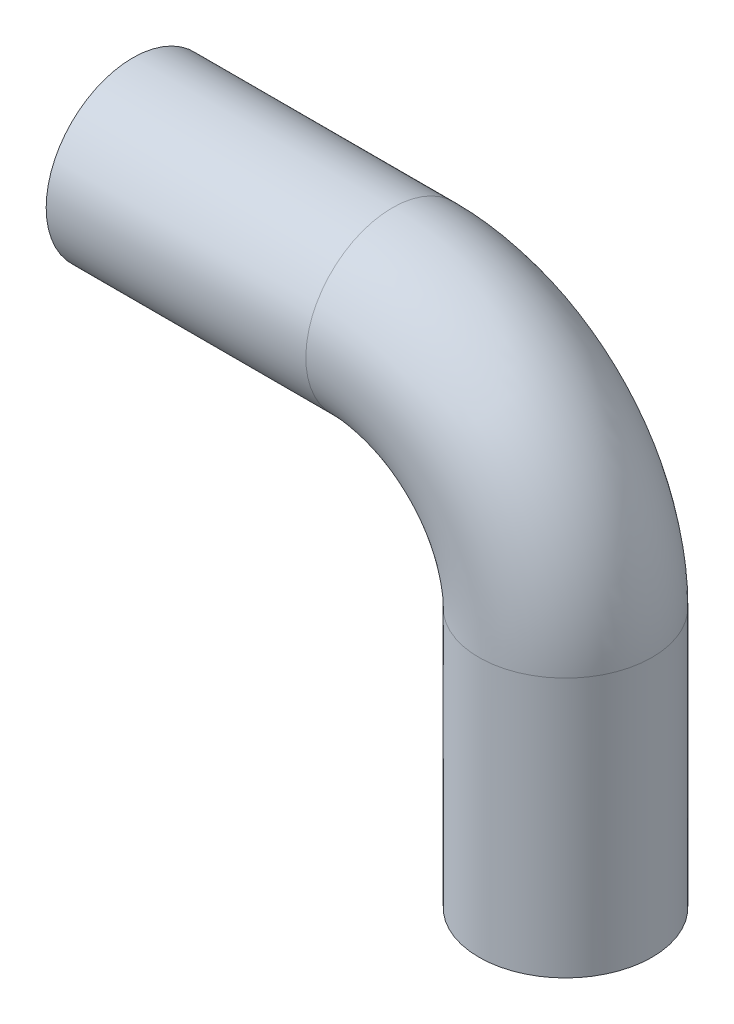
ISO-10303-21;
HEADER;
FILE_DESCRIPTION(('STEP AP214'),'2;1');
FILE_NAME('part.step','',(''),(''),'','','');
FILE_SCHEMA(('AUTOMOTIVE_DESIGN { 1 0 10303 214 1 1 1 1 }'));
ENDSEC;
DATA;
#1=APPLICATION_CONTEXT('core data for automotive mechanical design processes');
#2=APPLICATION_PROTOCOL_DEFINITION('international standard','automotive_design',2000,#1);
#3=PRODUCT_CONTEXT('',#1,'mechanical');
#4=PRODUCT('Part','Part','',(#3));
#5=PRODUCT_RELATED_PRODUCT_CATEGORY('part','',(#4));
#6=PRODUCT_DEFINITION_FORMATION('','',#4);
#7=PRODUCT_DEFINITION_CONTEXT('part definition',#1,'design');
#8=PRODUCT_DEFINITION('design','',#6,#7);
#9=PRODUCT_DEFINITION_SHAPE('','',#8);
#10=(LENGTH_UNIT() NAMED_UNIT(*) SI_UNIT(.MILLI.,.METRE.));
#11=(NAMED_UNIT(*) PLANE_ANGLE_UNIT() SI_UNIT($,.RADIAN.));
#12=(NAMED_UNIT(*) SI_UNIT($,.STERADIAN.) SOLID_ANGLE_UNIT());
#13=UNCERTAINTY_MEASURE_WITH_UNIT(LENGTH_MEASURE(1.E-05),#10,'distance_accuracy_value','');
#14=(GEOMETRIC_REPRESENTATION_CONTEXT(3) GLOBAL_UNCERTAINTY_ASSIGNED_CONTEXT((#13)) GLOBAL_UNIT_ASSIGNED_CONTEXT((#10,
#11,#12)) REPRESENTATION_CONTEXT('',''));
#15=CARTESIAN_POINT('',(0.,0.,0.));
#16=DIRECTION('',(0.,0.,1.));
#17=DIRECTION('',(1.,0.,0.));
#18=AXIS2_PLACEMENT_3D('',#15,#16,#17);
#19=CARTESIAN_POINT('',(0.,0.,0.));
#20=DIRECTION('',(-1.,0.,0.));
#21=DIRECTION('',(0.,0.,1.));
#22=AXIS2_PLACEMENT_3D('',#19,#20,#21);
#23=PLANE('',#22);
#24=CARTESIAN_POINT('',(0.,0.,0.));
#25=DIRECTION('',(-1.,0.,0.));
#26=DIRECTION('',(0.,-1.,0.));
#27=AXIS2_PLACEMENT_3D('',#24,#25,#26);
#28=CIRCLE('',#27,7.7);
#29=CARTESIAN_POINT('',(0.,-7.7,0.));
#30=VERTEX_POINT('',#29);
#31=EDGE_CURVE('E77',#30,#30,#28,.T.);
#32=ORIENTED_EDGE('',*,*,#31,.F.);
#33=EDGE_LOOP('',(#32));
#34=FACE_BOUND('',#33,.T.);
#35=CARTESIAN_POINT('',(0.,0.,0.));
#36=DIRECTION('',(-1.,0.,0.));
#37=DIRECTION('',(0.,0.,1.));
#38=AXIS2_PLACEMENT_3D('',#35,#36,#37);
#39=CIRCLE('',#38,10.);
#40=CARTESIAN_POINT('',(0.,0.,10.));
#41=VERTEX_POINT('',#40);
#42=EDGE_CURVE('E66',#41,#41,#39,.T.);
#43=ORIENTED_EDGE('',*,*,#42,.T.);
#44=EDGE_LOOP('',(#43));
#45=FACE_BOUND('',#44,.T.);
#46=ADVANCED_FACE('F49',(#34,#45),#23,.T.);
#47=CARTESIAN_POINT('',(50.,-50.,0.));
#48=DIRECTION('',(0.,1.,0.));
#49=DIRECTION('',(0.,0.,1.));
#50=AXIS2_PLACEMENT_3D('',#47,#48,#49);
#51=PLANE('',#50);
#52=CARTESIAN_POINT('',(50.,-50.,0.));
#53=DIRECTION('',(0.,1.,0.));
#54=DIRECTION('',(0.,0.,1.));
#55=AXIS2_PLACEMENT_3D('',#52,#53,#54);
#56=CIRCLE('',#55,7.7);
#57=CARTESIAN_POINT('',(50.,-50.,7.7));
#58=VERTEX_POINT('',#57);
#59=EDGE_CURVE('E72',#58,#58,#56,.T.);
#60=ORIENTED_EDGE('',*,*,#59,.T.);
#61=EDGE_LOOP('',(#60));
#62=FACE_BOUND('',#61,.T.);
#63=CARTESIAN_POINT('',(50.,-50.,0.));
#64=DIRECTION('',(0.,1.,0.));
#65=DIRECTION('',(0.,0.,1.));
#66=AXIS2_PLACEMENT_3D('',#63,#64,#65);
#67=CIRCLE('',#66,10.);
#68=CARTESIAN_POINT('',(50.,-50.,10.));
#69=VERTEX_POINT('',#68);
#70=EDGE_CURVE('E11',#69,#69,#67,.T.);
#71=ORIENTED_EDGE('',*,*,#70,.F.);
#72=EDGE_LOOP('',(#71));
#73=FACE_BOUND('',#72,.T.);
#74=ADVANCED_FACE('F100',(#62,#73),#51,.F.);
#75=CARTESIAN_POINT('',(0.,0.,0.));
#76=DIRECTION('',(1.,0.,0.));
#77=DIRECTION('',(0.,0.,-1.));
#78=AXIS2_PLACEMENT_3D('',#75,#76,#77);
#79=CYLINDRICAL_SURFACE('',#78,10.);
#80=CARTESIAN_POINT('',(29.9999999999999,0.,0.));
#81=DIRECTION('',(-1.,0.,0.));
#82=DIRECTION('',(0.,0.,1.));
#83=AXIS2_PLACEMENT_3D('',#80,#81,#82);
#84=CIRCLE('',#83,10.);
#85=CARTESIAN_POINT('',(29.9999999999998,10.,0.));
#86=VERTEX_POINT('',#85);
#87=EDGE_CURVE('E61',#86,#86,#84,.T.);
#88=ORIENTED_EDGE('',*,*,#87,.T.);
#89=EDGE_LOOP('',(#88));
#90=FACE_BOUND('',#89,.T.);
#91=ORIENTED_EDGE('',*,*,#42,.F.);
#92=EDGE_LOOP('',(#91));
#93=FACE_BOUND('',#92,.T.);
#94=ADVANCED_FACE('F104',(#90,#93),#79,.T.);
#95=CARTESIAN_POINT('',(30.,-20.,0.));
#96=DIRECTION('',(0.,0.,-1.));
#97=DIRECTION('',(-1.,0.,0.));
#98=AXIS2_PLACEMENT_3D('',#95,#96,#97);
#99=TOROIDAL_SURFACE('',#98,20.,10.);
#100=CARTESIAN_POINT('',(50.,-20.,0.));
#101=DIRECTION('',(0.,1.,0.));
#102=DIRECTION('',(0.,0.,1.));
#103=AXIS2_PLACEMENT_3D('',#100,#101,#102);
#104=CIRCLE('',#103,10.);
#105=CARTESIAN_POINT('',(60.,-20.,0.));
#106=VERTEX_POINT('',#105);
#107=EDGE_CURVE('E56',#106,#106,#104,.T.);
#108=CARTESIAN_POINT('',(30.,-20.,0.));
#109=DIRECTION('',(0.,0.,-1.));
#110=DIRECTION('',(-1.,0.,0.));
#111=AXIS2_PLACEMENT_3D('',#108,#109,#110);
#112=CIRCLE('',#111,30.);
#113=EDGE_CURVE('',#86,#106,#112,.T.);
#114=ORIENTED_EDGE('',*,*,#87,.F.);
#115=ORIENTED_EDGE('',*,*,#107,.T.);
#116=ORIENTED_EDGE('',*,*,#113,.T.);
#117=ORIENTED_EDGE('',*,*,#113,.F.);
#118=EDGE_LOOP('',(#114,#116,#115,#117));
#119=FACE_BOUND('',#118,.T.);
#120=ADVANCED_FACE('F106',(#119),#99,.T.);
#121=CARTESIAN_POINT('',(50.,-20.0000000000001,0.));
#122=DIRECTION('',(0.,-1.,0.));
#123=DIRECTION('',(1.,0.,0.));
#124=AXIS2_PLACEMENT_3D('',#121,#122,#123);
#125=CYLINDRICAL_SURFACE('',#124,10.);
#126=ORIENTED_EDGE('',*,*,#70,.T.);
#127=EDGE_LOOP('',(#126));
#128=FACE_BOUND('',#127,.T.);
#129=ORIENTED_EDGE('',*,*,#107,.F.);
#130=EDGE_LOOP('',(#129));
#131=FACE_BOUND('',#130,.T.);
#132=ADVANCED_FACE('F94',(#128,#131),#125,.T.);
#133=CARTESIAN_POINT('',(0.,0.,0.));
#134=DIRECTION('',(1.,0.,0.));
#135=DIRECTION('',(0.,0.,-1.));
#136=AXIS2_PLACEMENT_3D('',#133,#134,#135);
#137=CYLINDRICAL_SURFACE('',#136,7.7);
#138=CARTESIAN_POINT('',(29.9999999999999,0.,0.));
#139=DIRECTION('',(1.,0.,0.));
#140=DIRECTION('',(0.,0.,-1.));
#141=AXIS2_PLACEMENT_3D('',#138,#139,#140);
#142=CIRCLE('',#141,7.7);
#143=CARTESIAN_POINT('',(29.9999999999998,7.70000000000001,0.));
#144=VERTEX_POINT('',#143);
#145=EDGE_CURVE('E81',#144,#144,#142,.F.);
#146=ORIENTED_EDGE('',*,*,#145,.F.);
#147=EDGE_LOOP('',(#146));
#148=FACE_BOUND('',#147,.T.);
#149=ORIENTED_EDGE('',*,*,#31,.T.);
#150=EDGE_LOOP('',(#149));
#151=FACE_BOUND('',#150,.T.);
#152=ADVANCED_FACE('F91',(#148,#151),#137,.F.);
#153=CARTESIAN_POINT('',(30.,-20.,0.));
#154=DIRECTION('',(0.,0.,-1.));
#155=DIRECTION('',(-1.,0.,0.));
#156=AXIS2_PLACEMENT_3D('',#153,#154,#155);
#157=TOROIDAL_SURFACE('',#156,20.,7.7);
#158=CARTESIAN_POINT('',(50.,-20.,0.));
#159=DIRECTION('',(0.,1.,0.));
#160=DIRECTION('',(-1.,0.,0.));
#161=AXIS2_PLACEMENT_3D('',#158,#159,#160);
#162=CIRCLE('',#161,7.7);
#163=CARTESIAN_POINT('',(57.7,-20.,0.));
#164=VERTEX_POINT('',#163);
#165=EDGE_CURVE('E76',#164,#164,#162,.T.);
#166=CARTESIAN_POINT('',(30.,-20.,0.));
#167=DIRECTION('',(0.,0.,-1.));
#168=DIRECTION('',(-1.,0.,0.));
#169=AXIS2_PLACEMENT_3D('',#166,#167,#168);
#170=CIRCLE('',#169,27.7);
#171=EDGE_CURVE('',#144,#164,#170,.T.);
#172=ORIENTED_EDGE('',*,*,#145,.T.);
#173=ORIENTED_EDGE('',*,*,#165,.F.);
#174=ORIENTED_EDGE('',*,*,#171,.T.);
#175=ORIENTED_EDGE('',*,*,#171,.F.);
#176=EDGE_LOOP('',(#172,#174,#173,#175));
#177=FACE_BOUND('',#176,.T.);
#178=ADVANCED_FACE('F89',(#177),#157,.F.);
#179=CARTESIAN_POINT('',(50.,-20.0000000000001,0.));
#180=DIRECTION('',(0.,-1.,0.));
#181=DIRECTION('',(1.,0.,0.));
#182=AXIS2_PLACEMENT_3D('',#179,#180,#181);
#183=CYLINDRICAL_SURFACE('',#182,7.7);
#184=ORIENTED_EDGE('',*,*,#59,.F.);
#185=EDGE_LOOP('',(#184));
#186=FACE_BOUND('',#185,.T.);
#187=ORIENTED_EDGE('',*,*,#165,.T.);
#188=EDGE_LOOP('',(#187));
#189=FACE_BOUND('',#188,.T.);
#190=ADVANCED_FACE('F101',(#186,#189),#183,.F.);
#191=CLOSED_SHELL('',(#46,#74,#94,#120,#132,#152,#178,#190));
#192=MANIFOLD_SOLID_BREP('B2',#191);
#193=ADVANCED_BREP_SHAPE_REPRESENTATION('',(#18,#192),#14);
#194=SHAPE_DEFINITION_REPRESENTATION(#9,#193);
ENDSEC;
END-ISO-10303-21;
